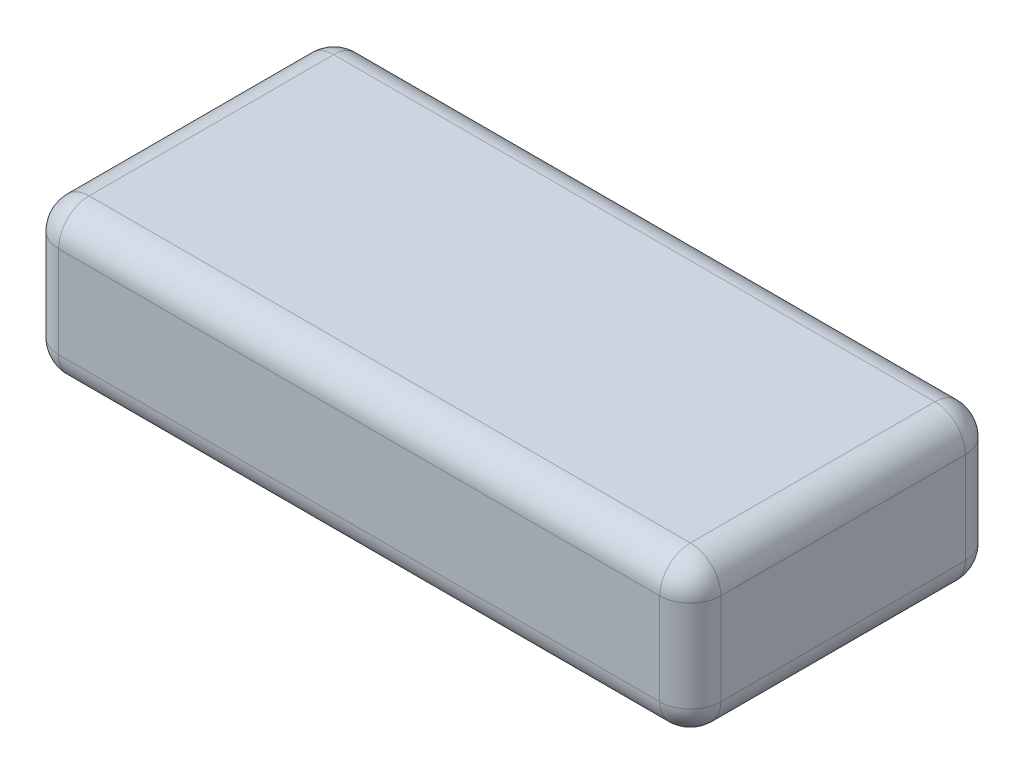
ISO-10303-21;
HEADER;
FILE_DESCRIPTION(('STEP AP214'),'2;1');
FILE_NAME('part.step','',(''),(''),'','','');
FILE_SCHEMA(('AUTOMOTIVE_DESIGN { 1 0 10303 214 1 1 1 1 }'));
ENDSEC;
DATA;
#1=APPLICATION_CONTEXT('core data for automotive mechanical design processes');
#2=APPLICATION_PROTOCOL_DEFINITION('international standard','automotive_design',2000,#1);
#3=PRODUCT_CONTEXT('',#1,'mechanical');
#4=PRODUCT('Part','Part','',(#3));
#5=PRODUCT_RELATED_PRODUCT_CATEGORY('part','',(#4));
#6=PRODUCT_DEFINITION_FORMATION('','',#4);
#7=PRODUCT_DEFINITION_CONTEXT('part definition',#1,'design');
#8=PRODUCT_DEFINITION('design','',#6,#7);
#9=PRODUCT_DEFINITION_SHAPE('','',#8);
#10=(LENGTH_UNIT() NAMED_UNIT(*) SI_UNIT(.MILLI.,.METRE.));
#11=(NAMED_UNIT(*) PLANE_ANGLE_UNIT() SI_UNIT($,.RADIAN.));
#12=(NAMED_UNIT(*) SI_UNIT($,.STERADIAN.) SOLID_ANGLE_UNIT());
#13=UNCERTAINTY_MEASURE_WITH_UNIT(LENGTH_MEASURE(1.E-05),#10,'distance_accuracy_value','');
#14=(GEOMETRIC_REPRESENTATION_CONTEXT(3) GLOBAL_UNCERTAINTY_ASSIGNED_CONTEXT((#13)) GLOBAL_UNIT_ASSIGNED_CONTEXT((#10,
#11,#12)) REPRESENTATION_CONTEXT('',''));
#15=CARTESIAN_POINT('',(0.,0.,0.));
#16=DIRECTION('',(0.,0.,1.));
#17=DIRECTION('',(1.,0.,0.));
#18=AXIS2_PLACEMENT_3D('',#15,#16,#17);
#19=CARTESIAN_POINT('',(32.5,15.,15.));
#20=DIRECTION('',(-1.,0.,0.));
#21=DIRECTION('',(0.,0.,1.));
#22=AXIS2_PLACEMENT_3D('',#19,#20,#21);
#23=PLANE('',#22);
#24=DIRECTION('',(0.,0.,-1.));
#25=VECTOR('',#24,1.);
#26=CARTESIAN_POINT('',(32.5,3.,-15.));
#27=LINE('',#26,#25);
#28=CARTESIAN_POINT('',(32.5,3.,12.));
#29=VERTEX_POINT('',#28);
#30=CARTESIAN_POINT('',(32.5,3.,-12.));
#31=VERTEX_POINT('',#30);
#32=EDGE_CURVE('E186',#29,#31,#27,.T.);
#33=ORIENTED_EDGE('',*,*,#32,.T.);
#34=DIRECTION('',(0.,-1.,0.));
#35=VECTOR('',#34,1.);
#36=CARTESIAN_POINT('',(32.5,15.,-12.));
#37=LINE('',#36,#35);
#38=CARTESIAN_POINT('',(32.5,12.,-12.));
#39=VERTEX_POINT('',#38);
#40=EDGE_CURVE('E191',#31,#39,#37,.F.);
#41=ORIENTED_EDGE('',*,*,#40,.T.);
#42=DIRECTION('',(0.,0.,-1.));
#43=VECTOR('',#42,1.);
#44=CARTESIAN_POINT('',(32.5,12.,15.));
#45=LINE('',#44,#43);
#46=CARTESIAN_POINT('',(32.5,12.,12.));
#47=VERTEX_POINT('',#46);
#48=EDGE_CURVE('E188',#39,#47,#45,.F.);
#49=ORIENTED_EDGE('',*,*,#48,.T.);
#50=DIRECTION('',(0.,-1.,0.));
#51=VECTOR('',#50,1.);
#52=CARTESIAN_POINT('',(32.5,15.,12.));
#53=LINE('',#52,#51);
#54=EDGE_CURVE('E184',#47,#29,#53,.T.);
#55=ORIENTED_EDGE('',*,*,#54,.T.);
#56=EDGE_LOOP('',(#33,#41,#49,#55));
#57=FACE_BOUND('',#56,.T.);
#58=ADVANCED_FACE('F32',(#57),#23,.F.);
#59=CARTESIAN_POINT('',(-32.5,15.,-15.));
#60=DIRECTION('',(0.,0.,1.));
#61=DIRECTION('',(1.,0.,0.));
#62=AXIS2_PLACEMENT_3D('',#59,#60,#61);
#63=PLANE('',#62);
#64=DIRECTION('',(-1.,0.,0.));
#65=VECTOR('',#64,1.);
#66=CARTESIAN_POINT('',(-32.5,12.,-15.));
#67=LINE('',#66,#65);
#68=CARTESIAN_POINT('',(-29.5,12.,-15.));
#69=VERTEX_POINT('',#68);
#70=CARTESIAN_POINT('',(29.5,12.,-15.));
#71=VERTEX_POINT('',#70);
#72=EDGE_CURVE('E179',#69,#71,#67,.F.);
#73=ORIENTED_EDGE('',*,*,#72,.T.);
#74=DIRECTION('',(0.,-1.,0.));
#75=VECTOR('',#74,1.);
#76=CARTESIAN_POINT('',(29.5,15.,-15.));
#77=LINE('',#76,#75);
#78=CARTESIAN_POINT('',(29.5,3.,-15.));
#79=VERTEX_POINT('',#78);
#80=EDGE_CURVE('E182',#71,#79,#77,.T.);
#81=ORIENTED_EDGE('',*,*,#80,.T.);
#82=DIRECTION('',(-1.,0.,0.));
#83=VECTOR('',#82,1.);
#84=CARTESIAN_POINT('',(-32.5,3.,-15.));
#85=LINE('',#84,#83);
#86=CARTESIAN_POINT('',(-29.5,3.,-15.));
#87=VERTEX_POINT('',#86);
#88=EDGE_CURVE('E177',#79,#87,#85,.T.);
#89=ORIENTED_EDGE('',*,*,#88,.T.);
#90=DIRECTION('',(0.,-1.,0.));
#91=VECTOR('',#90,1.);
#92=CARTESIAN_POINT('',(-29.5,15.,-15.));
#93=LINE('',#92,#91);
#94=EDGE_CURVE('E175',#87,#69,#93,.F.);
#95=ORIENTED_EDGE('',*,*,#94,.T.);
#96=EDGE_LOOP('',(#73,#81,#89,#95));
#97=FACE_BOUND('',#96,.T.);
#98=ADVANCED_FACE('F278',(#97),#63,.F.);
#99=CARTESIAN_POINT('',(-32.5,15.,15.));
#100=DIRECTION('',(1.,0.,0.));
#101=DIRECTION('',(0.,0.,-1.));
#102=AXIS2_PLACEMENT_3D('',#99,#100,#101);
#103=PLANE('',#102);
#104=DIRECTION('',(0.,0.,1.));
#105=VECTOR('',#104,1.);
#106=CARTESIAN_POINT('',(-32.5,12.,15.));
#107=LINE('',#106,#105);
#108=CARTESIAN_POINT('',(-32.5,12.,12.));
#109=VERTEX_POINT('',#108);
#110=CARTESIAN_POINT('',(-32.5,12.,-12.));
#111=VERTEX_POINT('',#110);
#112=EDGE_CURVE('E170',#109,#111,#107,.F.);
#113=ORIENTED_EDGE('',*,*,#112,.T.);
#114=DIRECTION('',(0.,-1.,0.));
#115=VECTOR('',#114,1.);
#116=CARTESIAN_POINT('',(-32.5,15.,-12.));
#117=LINE('',#116,#115);
#118=CARTESIAN_POINT('',(-32.5,3.,-12.));
#119=VERTEX_POINT('',#118);
#120=EDGE_CURVE('E173',#111,#119,#117,.T.);
#121=ORIENTED_EDGE('',*,*,#120,.T.);
#122=DIRECTION('',(0.,0.,1.));
#123=VECTOR('',#122,1.);
#124=CARTESIAN_POINT('',(-32.5,3.,15.));
#125=LINE('',#124,#123);
#126=CARTESIAN_POINT('',(-32.5,3.,12.));
#127=VERTEX_POINT('',#126);
#128=EDGE_CURVE('E168',#119,#127,#125,.T.);
#129=ORIENTED_EDGE('',*,*,#128,.T.);
#130=DIRECTION('',(0.,-1.,0.));
#131=VECTOR('',#130,1.);
#132=CARTESIAN_POINT('',(-32.5,15.,12.));
#133=LINE('',#132,#131);
#134=EDGE_CURVE('E166',#127,#109,#133,.F.);
#135=ORIENTED_EDGE('',*,*,#134,.T.);
#136=EDGE_LOOP('',(#113,#121,#129,#135));
#137=FACE_BOUND('',#136,.T.);
#138=ADVANCED_FACE('F269',(#137),#103,.F.);
#139=CARTESIAN_POINT('',(-32.5,15.,15.));
#140=DIRECTION('',(0.,0.,-1.));
#141=DIRECTION('',(-1.,0.,0.));
#142=AXIS2_PLACEMENT_3D('',#139,#140,#141);
#143=PLANE('',#142);
#144=DIRECTION('',(1.,0.,0.));
#145=VECTOR('',#144,1.);
#146=CARTESIAN_POINT('',(-32.5,12.,15.));
#147=LINE('',#146,#145);
#148=CARTESIAN_POINT('',(29.5,12.,15.));
#149=VERTEX_POINT('',#148);
#150=CARTESIAN_POINT('',(-29.5,12.,15.));
#151=VERTEX_POINT('',#150);
#152=EDGE_CURVE('E127',#149,#151,#147,.F.);
#153=ORIENTED_EDGE('',*,*,#152,.T.);
#154=DIRECTION('',(0.,-1.,0.));
#155=VECTOR('',#154,1.);
#156=CARTESIAN_POINT('',(-29.5,15.,15.));
#157=LINE('',#156,#155);
#158=CARTESIAN_POINT('',(-29.5,3.,15.));
#159=VERTEX_POINT('',#158);
#160=EDGE_CURVE('E164',#151,#159,#157,.T.);
#161=ORIENTED_EDGE('',*,*,#160,.T.);
#162=DIRECTION('',(1.,0.,0.));
#163=VECTOR('',#162,1.);
#164=CARTESIAN_POINT('',(32.5,3.,15.));
#165=LINE('',#164,#163);
#166=CARTESIAN_POINT('',(29.5,3.,15.));
#167=VERTEX_POINT('',#166);
#168=EDGE_CURVE('E157',#159,#167,#165,.T.);
#169=ORIENTED_EDGE('',*,*,#168,.T.);
#170=DIRECTION('',(0.,-1.,0.));
#171=VECTOR('',#170,1.);
#172=CARTESIAN_POINT('',(29.5,15.,15.));
#173=LINE('',#172,#171);
#174=EDGE_CURVE('E155',#167,#149,#173,.F.);
#175=ORIENTED_EDGE('',*,*,#174,.T.);
#176=EDGE_LOOP('',(#153,#161,#169,#175));
#177=FACE_BOUND('',#176,.T.);
#178=ADVANCED_FACE('F306',(#177),#143,.F.);
#179=CARTESIAN_POINT('',(0.,15.,0.));
#180=DIRECTION('',(0.,-1.,0.));
#181=DIRECTION('',(0.,0.,-1.));
#182=AXIS2_PLACEMENT_3D('',#179,#180,#181);
#183=PLANE('',#182);
#184=DIRECTION('',(0.,0.,1.));
#185=VECTOR('',#184,1.);
#186=CARTESIAN_POINT('',(-29.5,15.,0.));
#187=LINE('',#186,#185);
#188=CARTESIAN_POINT('',(-29.5,15.,-12.));
#189=VERTEX_POINT('',#188);
#190=CARTESIAN_POINT('',(-29.5,15.,12.));
#191=VERTEX_POINT('',#190);
#192=EDGE_CURVE('E153',#189,#191,#187,.T.);
#193=ORIENTED_EDGE('',*,*,#192,.T.);
#194=DIRECTION('',(1.,0.,0.));
#195=VECTOR('',#194,1.);
#196=CARTESIAN_POINT('',(0.,15.,12.));
#197=LINE('',#196,#195);
#198=CARTESIAN_POINT('',(29.5,15.,12.));
#199=VERTEX_POINT('',#198);
#200=EDGE_CURVE('E125',#191,#199,#197,.T.);
#201=ORIENTED_EDGE('',*,*,#200,.T.);
#202=DIRECTION('',(0.,0.,-1.));
#203=VECTOR('',#202,1.);
#204=CARTESIAN_POINT('',(29.5,15.,0.));
#205=LINE('',#204,#203);
#206=CARTESIAN_POINT('',(29.5,15.,-12.));
#207=VERTEX_POINT('',#206);
#208=EDGE_CURVE('E143',#199,#207,#205,.T.);
#209=ORIENTED_EDGE('',*,*,#208,.T.);
#210=DIRECTION('',(-1.,0.,0.));
#211=VECTOR('',#210,1.);
#212=CARTESIAN_POINT('',(0.,15.,-12.));
#213=LINE('',#212,#211);
#214=EDGE_CURVE('E149',#207,#189,#213,.T.);
#215=ORIENTED_EDGE('',*,*,#214,.T.);
#216=EDGE_LOOP('',(#193,#201,#209,#215));
#217=FACE_BOUND('',#216,.T.);
#218=ADVANCED_FACE('F151',(#217),#183,.F.);
#219=CARTESIAN_POINT('',(0.,0.,0.));
#220=DIRECTION('',(0.,-1.,0.));
#221=DIRECTION('',(0.,0.,-1.));
#222=AXIS2_PLACEMENT_3D('',#219,#220,#221);
#223=PLANE('',#222);
#224=DIRECTION('',(0.,0.,1.));
#225=VECTOR('',#224,1.);
#226=CARTESIAN_POINT('',(-29.5,0.,-15.));
#227=LINE('',#226,#225);
#228=CARTESIAN_POINT('',(-29.5,0.,12.));
#229=VERTEX_POINT('',#228);
#230=CARTESIAN_POINT('',(-29.5,0.,-12.));
#231=VERTEX_POINT('',#230);
#232=EDGE_CURVE('E41',#229,#231,#227,.F.);
#233=ORIENTED_EDGE('',*,*,#232,.T.);
#234=DIRECTION('',(-1.,0.,0.));
#235=VECTOR('',#234,1.);
#236=CARTESIAN_POINT('',(32.5,0.,-12.));
#237=LINE('',#236,#235);
#238=CARTESIAN_POINT('',(29.5,0.,-12.));
#239=VERTEX_POINT('',#238);
#240=EDGE_CURVE('E11',#231,#239,#237,.F.);
#241=ORIENTED_EDGE('',*,*,#240,.T.);
#242=DIRECTION('',(0.,0.,-1.));
#243=VECTOR('',#242,1.);
#244=CARTESIAN_POINT('',(29.5,0.,15.));
#245=LINE('',#244,#243);
#246=CARTESIAN_POINT('',(29.5,0.,12.));
#247=VERTEX_POINT('',#246);
#248=EDGE_CURVE('E193',#239,#247,#245,.F.);
#249=ORIENTED_EDGE('',*,*,#248,.T.);
#250=DIRECTION('',(1.,0.,0.));
#251=VECTOR('',#250,1.);
#252=CARTESIAN_POINT('',(-32.5,0.,12.));
#253=LINE('',#252,#251);
#254=EDGE_CURVE('E52',#247,#229,#253,.F.);
#255=ORIENTED_EDGE('',*,*,#254,.T.);
#256=EDGE_LOOP('',(#233,#241,#249,#255));
#257=FACE_BOUND('',#256,.T.);
#258=ADVANCED_FACE('F290',(#257),#223,.T.);
#259=CARTESIAN_POINT('',(-32.5,3.,-12.));
#260=DIRECTION('',(1.,0.,0.));
#261=DIRECTION('',(0.,0.,-1.));
#262=AXIS2_PLACEMENT_3D('',#259,#260,#261);
#263=CYLINDRICAL_SURFACE('',#262,3.);
#264=CARTESIAN_POINT('',(-29.5,3.,-12.));
#265=DIRECTION('',(-1.,0.,0.));
#266=DIRECTION('',(0.,0.,1.));
#267=AXIS2_PLACEMENT_3D('',#264,#265,#266);
#268=CIRCLE('',#267,3.);
#269=EDGE_CURVE('E36',#87,#231,#268,.T.);
#270=ORIENTED_EDGE('',*,*,#269,.F.);
#271=ORIENTED_EDGE('',*,*,#88,.F.);
#272=CARTESIAN_POINT('',(29.5,3.,-12.));
#273=DIRECTION('',(1.,0.,0.));
#274=DIRECTION('',(0.,0.,-1.));
#275=AXIS2_PLACEMENT_3D('',#272,#273,#274);
#276=CIRCLE('',#275,3.);
#277=EDGE_CURVE('E247',#239,#79,#276,.T.);
#278=ORIENTED_EDGE('',*,*,#277,.F.);
#279=ORIENTED_EDGE('',*,*,#240,.F.);
#280=EDGE_LOOP('',(#270,#271,#278,#279));
#281=FACE_BOUND('',#280,.T.);
#282=ADVANCED_FACE('F34',(#281),#263,.T.);
#283=CARTESIAN_POINT('',(-29.5,3.,-12.));
#284=DIRECTION('',(0.,0.,1.));
#285=DIRECTION('',(1.,0.,0.));
#286=AXIS2_PLACEMENT_3D('',#283,#284,#285);
#287=SPHERICAL_SURFACE('',#286,3.);
#288=CARTESIAN_POINT('',(-29.5,3.,-12.));
#289=DIRECTION('',(0.,-1.,0.));
#290=DIRECTION('',(0.,0.,-1.));
#291=AXIS2_PLACEMENT_3D('',#288,#289,#290);
#292=CIRCLE('',#291,3.);
#293=EDGE_CURVE('E242',#87,#119,#292,.F.);
#294=ORIENTED_EDGE('',*,*,#293,.F.);
#295=ORIENTED_EDGE('',*,*,#269,.T.);
#296=CARTESIAN_POINT('',(-29.5,3.,-12.));
#297=DIRECTION('',(0.,0.,-1.));
#298=DIRECTION('',(-1.,0.,0.));
#299=AXIS2_PLACEMENT_3D('',#296,#297,#298);
#300=CIRCLE('',#299,3.);
#301=EDGE_CURVE('E245',#119,#231,#300,.F.);
#302=ORIENTED_EDGE('',*,*,#301,.F.);
#303=EDGE_LOOP('',(#294,#295,#302));
#304=FACE_BOUND('',#303,.T.);
#305=ADVANCED_FACE('F258',(#304),#287,.T.);
#306=CARTESIAN_POINT('',(29.5,3.,-12.));
#307=DIRECTION('',(0.,0.,1.));
#308=DIRECTION('',(1.,0.,0.));
#309=AXIS2_PLACEMENT_3D('',#306,#307,#308);
#310=SPHERICAL_SURFACE('',#309,3.);
#311=CARTESIAN_POINT('',(29.5,3.,-12.));
#312=DIRECTION('',(0.,0.,-1.));
#313=DIRECTION('',(-1.,0.,0.));
#314=AXIS2_PLACEMENT_3D('',#311,#312,#313);
#315=CIRCLE('',#314,3.);
#316=EDGE_CURVE('E236',#239,#31,#315,.F.);
#317=ORIENTED_EDGE('',*,*,#316,.F.);
#318=ORIENTED_EDGE('',*,*,#277,.T.);
#319=CARTESIAN_POINT('',(29.5,3.,-12.));
#320=DIRECTION('',(0.,-1.,0.));
#321=DIRECTION('',(0.,0.,-1.));
#322=AXIS2_PLACEMENT_3D('',#319,#320,#321);
#323=CIRCLE('',#322,3.);
#324=EDGE_CURVE('E239',#31,#79,#323,.F.);
#325=ORIENTED_EDGE('',*,*,#324,.F.);
#326=EDGE_LOOP('',(#317,#318,#325));
#327=FACE_BOUND('',#326,.T.);
#328=ADVANCED_FACE('F457',(#327),#310,.T.);
#329=CARTESIAN_POINT('',(-29.5,3.,15.));
#330=DIRECTION('',(0.,0.,-1.));
#331=DIRECTION('',(-1.,0.,0.));
#332=AXIS2_PLACEMENT_3D('',#329,#330,#331);
#333=CYLINDRICAL_SURFACE('',#332,3.);
#334=ORIENTED_EDGE('',*,*,#301,.T.);
#335=ORIENTED_EDGE('',*,*,#232,.F.);
#336=CARTESIAN_POINT('',(-29.5,3.,12.));
#337=DIRECTION('',(0.,0.,1.));
#338=DIRECTION('',(1.,0.,0.));
#339=AXIS2_PLACEMENT_3D('',#336,#337,#338);
#340=CIRCLE('',#339,3.);
#341=EDGE_CURVE('E230',#127,#229,#340,.T.);
#342=ORIENTED_EDGE('',*,*,#341,.F.);
#343=ORIENTED_EDGE('',*,*,#128,.F.);
#344=EDGE_LOOP('',(#334,#335,#342,#343));
#345=FACE_BOUND('',#344,.T.);
#346=ADVANCED_FACE('F264',(#345),#333,.T.);
#347=CARTESIAN_POINT('',(-29.5,15.,-12.));
#348=DIRECTION('',(0.,-1.,0.));
#349=DIRECTION('',(0.,0.,-1.));
#350=AXIS2_PLACEMENT_3D('',#347,#348,#349);
#351=CYLINDRICAL_SURFACE('',#350,3.);
#352=ORIENTED_EDGE('',*,*,#293,.T.);
#353=ORIENTED_EDGE('',*,*,#120,.F.);
#354=CARTESIAN_POINT('',(-29.5,12.,-12.));
#355=DIRECTION('',(0.,1.,0.));
#356=DIRECTION('',(0.,0.,1.));
#357=AXIS2_PLACEMENT_3D('',#354,#355,#356);
#358=CIRCLE('',#357,3.);
#359=EDGE_CURVE('E227',#69,#111,#358,.T.);
#360=ORIENTED_EDGE('',*,*,#359,.F.);
#361=ORIENTED_EDGE('',*,*,#94,.F.);
#362=EDGE_LOOP('',(#352,#353,#360,#361));
#363=FACE_BOUND('',#362,.T.);
#364=ADVANCED_FACE('F275',(#363),#351,.T.);
#365=CARTESIAN_POINT('',(0.,12.,-12.));
#366=DIRECTION('',(-1.,0.,0.));
#367=DIRECTION('',(0.,0.,1.));
#368=AXIS2_PLACEMENT_3D('',#365,#366,#367);
#369=CYLINDRICAL_SURFACE('',#368,3.);
#370=CARTESIAN_POINT('',(29.5,12.,-12.));
#371=DIRECTION('',(1.,0.,0.));
#372=DIRECTION('',(0.,1.,0.));
#373=AXIS2_PLACEMENT_3D('',#370,#371,#372);
#374=CIRCLE('',#373,3.);
#375=EDGE_CURVE('E221',#71,#207,#374,.T.);
#376=ORIENTED_EDGE('',*,*,#375,.F.);
#377=ORIENTED_EDGE('',*,*,#72,.F.);
#378=CARTESIAN_POINT('',(-29.5,12.,-12.));
#379=DIRECTION('',(-1.,0.,0.));
#380=DIRECTION('',(0.,0.,1.));
#381=AXIS2_PLACEMENT_3D('',#378,#379,#380);
#382=CIRCLE('',#381,3.);
#383=EDGE_CURVE('E224',#189,#69,#382,.T.);
#384=ORIENTED_EDGE('',*,*,#383,.F.);
#385=ORIENTED_EDGE('',*,*,#214,.F.);
#386=EDGE_LOOP('',(#376,#377,#384,#385));
#387=FACE_BOUND('',#386,.T.);
#388=ADVANCED_FACE('F282',(#387),#369,.T.);
#389=CARTESIAN_POINT('',(29.5,15.,-12.));
#390=DIRECTION('',(0.,-1.,0.));
#391=DIRECTION('',(0.,0.,-1.));
#392=AXIS2_PLACEMENT_3D('',#389,#390,#391);
#393=CYLINDRICAL_SURFACE('',#392,3.);
#394=ORIENTED_EDGE('',*,*,#324,.T.);
#395=ORIENTED_EDGE('',*,*,#80,.F.);
#396=CARTESIAN_POINT('',(29.5,12.,-12.));
#397=DIRECTION('',(0.,1.,0.));
#398=DIRECTION('',(0.,0.,1.));
#399=AXIS2_PLACEMENT_3D('',#396,#397,#398);
#400=CIRCLE('',#399,3.);
#401=EDGE_CURVE('E219',#39,#71,#400,.T.);
#402=ORIENTED_EDGE('',*,*,#401,.F.);
#403=ORIENTED_EDGE('',*,*,#40,.F.);
#404=EDGE_LOOP('',(#394,#395,#402,#403));
#405=FACE_BOUND('',#404,.T.);
#406=ADVANCED_FACE('F288',(#405),#393,.T.);
#407=CARTESIAN_POINT('',(29.5,3.,15.));
#408=DIRECTION('',(0.,0.,1.));
#409=DIRECTION('',(1.,0.,0.));
#410=AXIS2_PLACEMENT_3D('',#407,#408,#409);
#411=CYLINDRICAL_SURFACE('',#410,3.);
#412=ORIENTED_EDGE('',*,*,#316,.T.);
#413=ORIENTED_EDGE('',*,*,#32,.F.);
#414=CARTESIAN_POINT('',(29.5,3.,12.));
#415=DIRECTION('',(0.,0.,1.));
#416=DIRECTION('',(1.,0.,0.));
#417=AXIS2_PLACEMENT_3D('',#414,#415,#416);
#418=CIRCLE('',#417,3.);
#419=EDGE_CURVE('E216',#247,#29,#418,.T.);
#420=ORIENTED_EDGE('',*,*,#419,.F.);
#421=ORIENTED_EDGE('',*,*,#248,.F.);
#422=EDGE_LOOP('',(#412,#413,#420,#421));
#423=FACE_BOUND('',#422,.T.);
#424=ADVANCED_FACE('F299',(#423),#411,.T.);
#425=CARTESIAN_POINT('',(-32.5,3.,12.));
#426=DIRECTION('',(-1.,0.,0.));
#427=DIRECTION('',(0.,0.,1.));
#428=AXIS2_PLACEMENT_3D('',#425,#426,#427);
#429=CYLINDRICAL_SURFACE('',#428,3.);
#430=CARTESIAN_POINT('',(-29.5,3.,12.));
#431=DIRECTION('',(-1.,0.,0.));
#432=DIRECTION('',(0.,0.,1.));
#433=AXIS2_PLACEMENT_3D('',#430,#431,#432);
#434=CIRCLE('',#433,3.);
#435=EDGE_CURVE('E233',#229,#159,#434,.T.);
#436=ORIENTED_EDGE('',*,*,#435,.F.);
#437=ORIENTED_EDGE('',*,*,#254,.F.);
#438=CARTESIAN_POINT('',(29.5,3.,12.));
#439=DIRECTION('',(1.,0.,0.));
#440=DIRECTION('',(0.,0.,-1.));
#441=AXIS2_PLACEMENT_3D('',#438,#439,#440);
#442=CIRCLE('',#441,3.);
#443=EDGE_CURVE('E213',#167,#247,#442,.T.);
#444=ORIENTED_EDGE('',*,*,#443,.F.);
#445=ORIENTED_EDGE('',*,*,#168,.F.);
#446=EDGE_LOOP('',(#436,#437,#444,#445));
#447=FACE_BOUND('',#446,.T.);
#448=ADVANCED_FACE('F295',(#447),#429,.T.);
#449=CARTESIAN_POINT('',(-29.5,3.,12.));
#450=DIRECTION('',(0.,0.,1.));
#451=DIRECTION('',(1.,0.,0.));
#452=AXIS2_PLACEMENT_3D('',#449,#450,#451);
#453=SPHERICAL_SURFACE('',#452,3.);
#454=ORIENTED_EDGE('',*,*,#341,.T.);
#455=ORIENTED_EDGE('',*,*,#435,.T.);
#456=CARTESIAN_POINT('',(-29.5,3.,12.));
#457=DIRECTION('',(0.,-1.,0.));
#458=DIRECTION('',(0.,0.,-1.));
#459=AXIS2_PLACEMENT_3D('',#456,#457,#458);
#460=CIRCLE('',#459,3.);
#461=EDGE_CURVE('E210',#127,#159,#460,.F.);
#462=ORIENTED_EDGE('',*,*,#461,.F.);
#463=EDGE_LOOP('',(#454,#455,#462));
#464=FACE_BOUND('',#463,.T.);
#465=ADVANCED_FACE('F309',(#464),#453,.T.);
#466=CARTESIAN_POINT('',(-29.5,12.,-12.));
#467=DIRECTION('',(0.,0.,1.));
#468=DIRECTION('',(1.,0.,0.));
#469=AXIS2_PLACEMENT_3D('',#466,#467,#468);
#470=SPHERICAL_SURFACE('',#469,3.);
#471=ORIENTED_EDGE('',*,*,#383,.T.);
#472=ORIENTED_EDGE('',*,*,#359,.T.);
#473=CARTESIAN_POINT('',(-29.5,12.,-12.));
#474=DIRECTION('',(0.,0.,-1.));
#475=DIRECTION('',(-1.,0.,0.));
#476=AXIS2_PLACEMENT_3D('',#473,#474,#475);
#477=CIRCLE('',#476,3.);
#478=EDGE_CURVE('E208',#189,#111,#477,.F.);
#479=ORIENTED_EDGE('',*,*,#478,.F.);
#480=EDGE_LOOP('',(#471,#472,#479));
#481=FACE_BOUND('',#480,.T.);
#482=ADVANCED_FACE('F319',(#481),#470,.T.);
#483=CARTESIAN_POINT('',(29.5,12.,-12.));
#484=DIRECTION('',(0.,0.,1.));
#485=DIRECTION('',(1.,0.,0.));
#486=AXIS2_PLACEMENT_3D('',#483,#484,#485);
#487=SPHERICAL_SURFACE('',#486,3.);
#488=ORIENTED_EDGE('',*,*,#401,.T.);
#489=ORIENTED_EDGE('',*,*,#375,.T.);
#490=CARTESIAN_POINT('',(29.5,12.,-12.));
#491=DIRECTION('',(0.,0.,-1.));
#492=DIRECTION('',(-1.,0.,0.));
#493=AXIS2_PLACEMENT_3D('',#490,#491,#492);
#494=CIRCLE('',#493,3.);
#495=EDGE_CURVE('E146',#39,#207,#494,.F.);
#496=ORIENTED_EDGE('',*,*,#495,.F.);
#497=EDGE_LOOP('',(#488,#489,#496));
#498=FACE_BOUND('',#497,.T.);
#499=ADVANCED_FACE('F321',(#498),#487,.T.);
#500=CARTESIAN_POINT('',(29.5,3.,12.));
#501=DIRECTION('',(0.,0.,1.));
#502=DIRECTION('',(1.,0.,0.));
#503=AXIS2_PLACEMENT_3D('',#500,#501,#502);
#504=SPHERICAL_SURFACE('',#503,3.);
#505=ORIENTED_EDGE('',*,*,#443,.T.);
#506=ORIENTED_EDGE('',*,*,#419,.T.);
#507=CARTESIAN_POINT('',(29.5,3.,12.));
#508=DIRECTION('',(0.,-1.,0.));
#509=DIRECTION('',(0.,0.,-1.));
#510=AXIS2_PLACEMENT_3D('',#507,#508,#509);
#511=CIRCLE('',#510,3.);
#512=EDGE_CURVE('E204',#167,#29,#511,.F.);
#513=ORIENTED_EDGE('',*,*,#512,.F.);
#514=EDGE_LOOP('',(#505,#506,#513));
#515=FACE_BOUND('',#514,.T.);
#516=ADVANCED_FACE('F301',(#515),#504,.T.);
#517=CARTESIAN_POINT('',(-29.5,15.,12.));
#518=DIRECTION('',(0.,-1.,0.));
#519=DIRECTION('',(0.,0.,-1.));
#520=AXIS2_PLACEMENT_3D('',#517,#518,#519);
#521=CYLINDRICAL_SURFACE('',#520,3.);
#522=ORIENTED_EDGE('',*,*,#461,.T.);
#523=ORIENTED_EDGE('',*,*,#160,.F.);
#524=CARTESIAN_POINT('',(-29.5,12.,12.));
#525=DIRECTION('',(0.,1.,0.));
#526=DIRECTION('',(0.,0.,1.));
#527=AXIS2_PLACEMENT_3D('',#524,#525,#526);
#528=CIRCLE('',#527,3.);
#529=EDGE_CURVE('E201',#109,#151,#528,.T.);
#530=ORIENTED_EDGE('',*,*,#529,.F.);
#531=ORIENTED_EDGE('',*,*,#134,.F.);
#532=EDGE_LOOP('',(#522,#523,#530,#531));
#533=FACE_BOUND('',#532,.T.);
#534=ADVANCED_FACE('F311',(#533),#521,.T.);
#535=CARTESIAN_POINT('',(-29.5,12.,0.));
#536=DIRECTION('',(0.,0.,1.));
#537=DIRECTION('',(1.,0.,0.));
#538=AXIS2_PLACEMENT_3D('',#535,#536,#537);
#539=CYLINDRICAL_SURFACE('',#538,3.);
#540=ORIENTED_EDGE('',*,*,#478,.T.);
#541=ORIENTED_EDGE('',*,*,#112,.F.);
#542=CARTESIAN_POINT('',(-29.5,12.,12.));
#543=DIRECTION('',(0.,0.,1.));
#544=DIRECTION('',(1.,0.,0.));
#545=AXIS2_PLACEMENT_3D('',#542,#543,#544);
#546=CIRCLE('',#545,3.);
#547=EDGE_CURVE('E140',#191,#109,#546,.T.);
#548=ORIENTED_EDGE('',*,*,#547,.F.);
#549=ORIENTED_EDGE('',*,*,#192,.F.);
#550=EDGE_LOOP('',(#540,#541,#548,#549));
#551=FACE_BOUND('',#550,.T.);
#552=ADVANCED_FACE('F317',(#551),#539,.T.);
#553=CARTESIAN_POINT('',(29.5,12.,0.));
#554=DIRECTION('',(0.,0.,-1.));
#555=DIRECTION('',(-1.,0.,0.));
#556=AXIS2_PLACEMENT_3D('',#553,#554,#555);
#557=CYLINDRICAL_SURFACE('',#556,3.);
#558=ORIENTED_EDGE('',*,*,#495,.T.);
#559=ORIENTED_EDGE('',*,*,#208,.F.);
#560=CARTESIAN_POINT('',(29.5,12.,12.));
#561=DIRECTION('',(0.,0.,1.));
#562=DIRECTION('',(1.,0.,0.));
#563=AXIS2_PLACEMENT_3D('',#560,#561,#562);
#564=CIRCLE('',#563,3.);
#565=EDGE_CURVE('E132',#47,#199,#564,.T.);
#566=ORIENTED_EDGE('',*,*,#565,.F.);
#567=ORIENTED_EDGE('',*,*,#48,.F.);
#568=EDGE_LOOP('',(#558,#559,#566,#567));
#569=FACE_BOUND('',#568,.T.);
#570=ADVANCED_FACE('F144',(#569),#557,.T.);
#571=CARTESIAN_POINT('',(29.5,15.,12.));
#572=DIRECTION('',(0.,-1.,0.));
#573=DIRECTION('',(0.,0.,-1.));
#574=AXIS2_PLACEMENT_3D('',#571,#572,#573);
#575=CYLINDRICAL_SURFACE('',#574,3.);
#576=ORIENTED_EDGE('',*,*,#512,.T.);
#577=ORIENTED_EDGE('',*,*,#54,.F.);
#578=CARTESIAN_POINT('',(29.5,12.,12.));
#579=DIRECTION('',(0.,1.,0.));
#580=DIRECTION('',(0.,0.,1.));
#581=AXIS2_PLACEMENT_3D('',#578,#579,#580);
#582=CIRCLE('',#581,3.);
#583=EDGE_CURVE('E136',#149,#47,#582,.T.);
#584=ORIENTED_EDGE('',*,*,#583,.F.);
#585=ORIENTED_EDGE('',*,*,#174,.F.);
#586=EDGE_LOOP('',(#576,#577,#584,#585));
#587=FACE_BOUND('',#586,.T.);
#588=ADVANCED_FACE('F304',(#587),#575,.T.);
#589=CARTESIAN_POINT('',(-29.5,12.,12.));
#590=DIRECTION('',(0.,0.,1.));
#591=DIRECTION('',(1.,0.,0.));
#592=AXIS2_PLACEMENT_3D('',#589,#590,#591);
#593=SPHERICAL_SURFACE('',#592,3.);
#594=ORIENTED_EDGE('',*,*,#547,.T.);
#595=ORIENTED_EDGE('',*,*,#529,.T.);
#596=CARTESIAN_POINT('',(-29.5,12.,12.));
#597=DIRECTION('',(-1.,0.,0.));
#598=DIRECTION('',(0.,0.,1.));
#599=AXIS2_PLACEMENT_3D('',#596,#597,#598);
#600=CIRCLE('',#599,3.);
#601=EDGE_CURVE('E129',#191,#151,#600,.F.);
#602=ORIENTED_EDGE('',*,*,#601,.F.);
#603=EDGE_LOOP('',(#594,#595,#602));
#604=FACE_BOUND('',#603,.T.);
#605=ADVANCED_FACE('F315',(#604),#593,.T.);
#606=CARTESIAN_POINT('',(29.5,12.,12.));
#607=DIRECTION('',(0.,0.,1.));
#608=DIRECTION('',(1.,0.,0.));
#609=AXIS2_PLACEMENT_3D('',#606,#607,#608);
#610=SPHERICAL_SURFACE('',#609,3.);
#611=ORIENTED_EDGE('',*,*,#583,.T.);
#612=ORIENTED_EDGE('',*,*,#565,.T.);
#613=CARTESIAN_POINT('',(29.5,12.,12.));
#614=DIRECTION('',(1.,0.,0.));
#615=DIRECTION('',(0.,0.,-1.));
#616=AXIS2_PLACEMENT_3D('',#613,#614,#615);
#617=CIRCLE('',#616,3.);
#618=EDGE_CURVE('E121',#149,#199,#617,.F.);
#619=ORIENTED_EDGE('',*,*,#618,.F.);
#620=EDGE_LOOP('',(#611,#612,#619));
#621=FACE_BOUND('',#620,.T.);
#622=ADVANCED_FACE('F134',(#621),#610,.T.);
#623=CARTESIAN_POINT('',(0.,12.,12.));
#624=DIRECTION('',(1.,0.,0.));
#625=DIRECTION('',(0.,0.,-1.));
#626=AXIS2_PLACEMENT_3D('',#623,#624,#625);
#627=CYLINDRICAL_SURFACE('',#626,3.);
#628=ORIENTED_EDGE('',*,*,#601,.T.);
#629=ORIENTED_EDGE('',*,*,#152,.F.);
#630=ORIENTED_EDGE('',*,*,#618,.T.);
#631=ORIENTED_EDGE('',*,*,#200,.F.);
#632=EDGE_LOOP('',(#628,#629,#630,#631));
#633=FACE_BOUND('',#632,.T.);
#634=ADVANCED_FACE('F123',(#633),#627,.T.);
#635=CLOSED_SHELL('',(#58,#98,#138,#178,#218,#258,#282,#305,#328,#346,#364,#388,#406,#424,#448,
#465,#482,#499,#516,#534,#552,#570,#588,#605,#622,#634));
#636=MANIFOLD_SOLID_BREP('B2',#635);
#637=ADVANCED_BREP_SHAPE_REPRESENTATION('',(#18,#636),#14);
#638=SHAPE_DEFINITION_REPRESENTATION(#9,#637);
ENDSEC;
END-ISO-10303-21;
